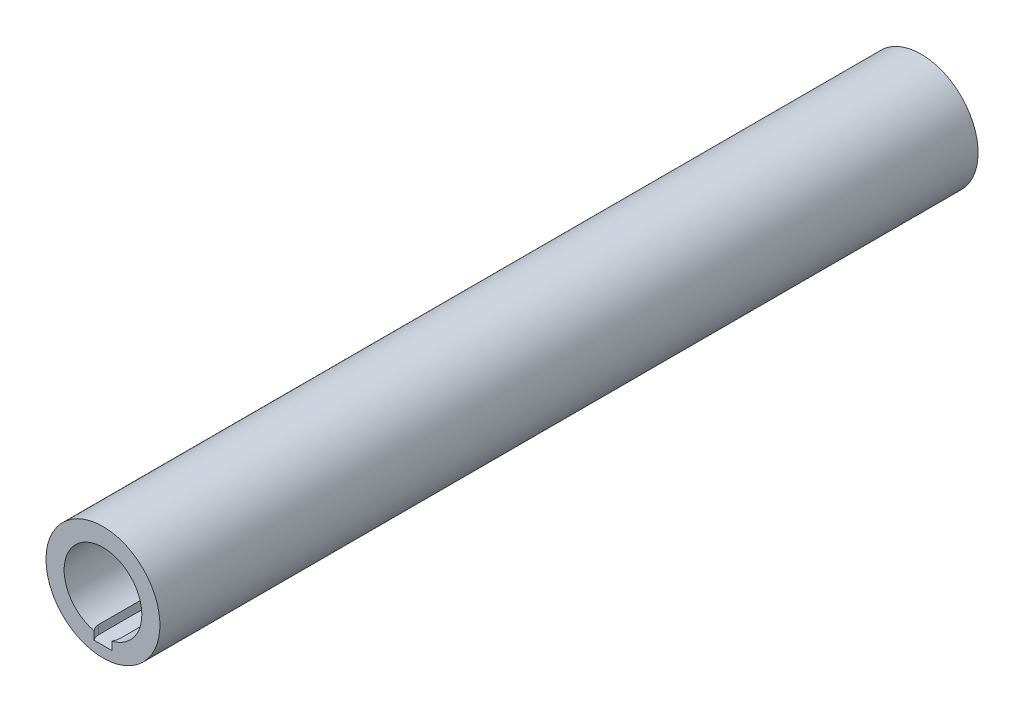
ISO-10303-21;
HEADER;
FILE_DESCRIPTION(('STEP AP214'),'2;1');
FILE_NAME('part.step','',(''),(''),'','','');
FILE_SCHEMA(('AUTOMOTIVE_DESIGN { 1 0 10303 214 1 1 1 1 }'));
ENDSEC;
DATA;
#1=APPLICATION_CONTEXT('core data for automotive mechanical design processes');
#2=APPLICATION_PROTOCOL_DEFINITION('international standard','automotive_design',2000,#1);
#3=PRODUCT_CONTEXT('',#1,'mechanical');
#4=PRODUCT('Part','Part','',(#3));
#5=PRODUCT_RELATED_PRODUCT_CATEGORY('part','',(#4));
#6=PRODUCT_DEFINITION_FORMATION('','',#4);
#7=PRODUCT_DEFINITION_CONTEXT('part definition',#1,'design');
#8=PRODUCT_DEFINITION('design','',#6,#7);
#9=PRODUCT_DEFINITION_SHAPE('','',#8);
#10=(LENGTH_UNIT() NAMED_UNIT(*) SI_UNIT(.MILLI.,.METRE.));
#11=(NAMED_UNIT(*) PLANE_ANGLE_UNIT() SI_UNIT($,.RADIAN.));
#12=(NAMED_UNIT(*) SI_UNIT($,.STERADIAN.) SOLID_ANGLE_UNIT());
#13=UNCERTAINTY_MEASURE_WITH_UNIT(LENGTH_MEASURE(1.E-05),#10,'distance_accuracy_value','');
#14=(GEOMETRIC_REPRESENTATION_CONTEXT(3) GLOBAL_UNCERTAINTY_ASSIGNED_CONTEXT((#13)) GLOBAL_UNIT_ASSIGNED_CONTEXT((#10,
#11,#12)) REPRESENTATION_CONTEXT('',''));
#15=CARTESIAN_POINT('',(0.,0.,0.));
#16=DIRECTION('',(0.,0.,1.));
#17=DIRECTION('',(1.,0.,0.));
#18=AXIS2_PLACEMENT_3D('',#15,#16,#17);
#19=CARTESIAN_POINT('',(25.4999999999999,0.,-516.518644329431));
#20=DIRECTION('',(0.,0.,-1.));
#21=DIRECTION('',(-1.,0.,0.));
#22=AXIS2_PLACEMENT_3D('',#19,#20,#21);
#23=PLANE('',#22);
#24=CARTESIAN_POINT('',(-1.80000000000006,0.,-516.518644329431));
#25=DIRECTION('',(0.,0.,-1.));
#26=DIRECTION('',(-1.,0.,0.));
#27=AXIS2_PLACEMENT_3D('',#24,#25,#26);
#28=CIRCLE('',#27,40.);
#29=CARTESIAN_POINT('',(-41.8000000000001,0.,-516.518644329431));
#30=VERTEX_POINT('',#29);
#31=EDGE_CURVE('E254',#30,#30,#28,.T.);
#32=ORIENTED_EDGE('',*,*,#31,.T.);
#33=EDGE_LOOP('',(#32));
#34=FACE_BOUND('',#33,.T.);
#35=CARTESIAN_POINT('',(-1.80000000000006,0.,-516.518644329431));
#36=DIRECTION('',(0.,0.,-1.));
#37=DIRECTION('',(-1.,0.,0.));
#38=AXIS2_PLACEMENT_3D('',#35,#36,#37);
#39=CIRCLE('',#38,27.3);
#40=CARTESIAN_POINT('',(-9.79999999999999,-26.101532522057,-516.518644329431));
#41=VERTEX_POINT('',#40);
#42=CARTESIAN_POINT('',(6.19999999999995,-26.101532522057,-516.518644329431));
#43=VERTEX_POINT('',#42);
#44=EDGE_CURVE('E257',#41,#43,#39,.T.);
#45=ORIENTED_EDGE('',*,*,#44,.F.);
#46=DIRECTION('',(0.,-1.,0.));
#47=VECTOR('',#46,1.);
#48=CARTESIAN_POINT('',(-9.80000000000017,0.,-516.518644329431));
#49=LINE('',#48,#47);
#50=CARTESIAN_POINT('',(-9.80000000000016,-32.3,-516.518644329431));
#51=VERTEX_POINT('',#50);
#52=EDGE_CURVE('E179',#41,#51,#49,.T.);
#53=ORIENTED_EDGE('',*,*,#52,.T.);
#54=DIRECTION('',(1.,0.,0.));
#55=VECTOR('',#54,1.);
#56=CARTESIAN_POINT('',(25.4999999999999,-32.3,-516.518644329431));
#57=LINE('',#56,#55);
#58=CARTESIAN_POINT('',(6.19999999999984,-32.3,-516.518644329431));
#59=VERTEX_POINT('',#58);
#60=EDGE_CURVE('E11',#51,#59,#57,.T.);
#61=ORIENTED_EDGE('',*,*,#60,.T.);
#62=DIRECTION('',(0.,1.,0.));
#63=VECTOR('',#62,1.);
#64=CARTESIAN_POINT('',(6.19999999999984,0.,-516.518644329431));
#65=LINE('',#64,#63);
#66=EDGE_CURVE('E148',#59,#43,#65,.T.);
#67=ORIENTED_EDGE('',*,*,#66,.T.);
#68=EDGE_LOOP('',(#45,#53,#61,#67));
#69=FACE_BOUND('',#68,.T.);
#70=ADVANCED_FACE('F43',(#34,#69),#23,.T.);
#71=CARTESIAN_POINT('',(38.1999999999999,0.,57.9999996705684));
#72=DIRECTION('',(0.,0.,1.));
#73=DIRECTION('',(1.,0.,0.));
#74=AXIS2_PLACEMENT_3D('',#71,#72,#73);
#75=PLANE('',#74);
#76=CARTESIAN_POINT('',(-1.80000000000013,0.,57.9999996705684));
#77=DIRECTION('',(0.,0.,-1.));
#78=DIRECTION('',(-1.,0.,0.));
#79=AXIS2_PLACEMENT_3D('',#76,#77,#78);
#80=CIRCLE('',#79,40.0000000000001);
#81=CARTESIAN_POINT('',(-41.8000000000002,0.,57.9999996705684));
#82=VERTEX_POINT('',#81);
#83=EDGE_CURVE('E292',#82,#82,#80,.T.);
#84=ORIENTED_EDGE('',*,*,#83,.F.);
#85=EDGE_LOOP('',(#84));
#86=FACE_BOUND('',#85,.T.);
#87=DIRECTION('',(-1.,0.,0.));
#88=VECTOR('',#87,1.);
#89=CARTESIAN_POINT('',(38.1999999999999,-32.3,57.9999996705684));
#90=LINE('',#89,#88);
#91=CARTESIAN_POINT('',(4.44499826260965,-32.3,57.9999996705684));
#92=VERTEX_POINT('',#91);
#93=CARTESIAN_POINT('',(-8.04499826260998,-32.3,57.9999996705684));
#94=VERTEX_POINT('',#93);
#95=EDGE_CURVE('E50',#92,#94,#90,.T.);
#96=ORIENTED_EDGE('',*,*,#95,.T.);
#97=DIRECTION('',(0.,-1.,0.));
#98=VECTOR('',#97,1.);
#99=CARTESIAN_POINT('',(-8.04499826260998,-17.3,57.9999996705684));
#100=LINE('',#99,#98);
#101=CARTESIAN_POINT('',(-8.04499826260997,-26.5761170357899,57.9999996705684));
#102=VERTEX_POINT('',#101);
#103=EDGE_CURVE('E267',#94,#102,#100,.F.);
#104=ORIENTED_EDGE('',*,*,#103,.T.);
#105=CARTESIAN_POINT('',(-1.80000000000013,0.,57.9999996705684));
#106=DIRECTION('',(0.,0.,-1.));
#107=DIRECTION('',(-1.,0.,0.));
#108=AXIS2_PLACEMENT_3D('',#105,#106,#107);
#109=CIRCLE('',#108,27.3);
#110=CARTESIAN_POINT('',(4.44499826260965,-26.5761170357899,57.9999996705684));
#111=VERTEX_POINT('',#110);
#112=EDGE_CURVE('E289',#102,#111,#109,.T.);
#113=ORIENTED_EDGE('',*,*,#112,.T.);
#114=DIRECTION('',(0.,-1.,0.));
#115=VECTOR('',#114,1.);
#116=CARTESIAN_POINT('',(4.44499826260965,-17.3,57.9999996705684));
#117=LINE('',#116,#115);
#118=EDGE_CURVE('E261',#111,#92,#117,.T.);
#119=ORIENTED_EDGE('',*,*,#118,.T.);
#120=EDGE_LOOP('',(#96,#104,#113,#119));
#121=FACE_BOUND('',#120,.T.);
#122=ADVANCED_FACE('F241',(#86,#121),#75,.T.);
#123=CARTESIAN_POINT('',(-1.80000000000013,0.,70.));
#124=DIRECTION('',(0.,0.,-1.));
#125=DIRECTION('',(-1.,0.,0.));
#126=AXIS2_PLACEMENT_3D('',#123,#124,#125);
#127=CYLINDRICAL_SURFACE('',#126,27.3);
#128=DIRECTION('',(0.,0.,-1.));
#129=VECTOR('',#128,1.);
#130=CARTESIAN_POINT('',(6.19999999999984,-26.101532522057,70.));
#131=LINE('',#130,#129);
#132=CARTESIAN_POINT('',(6.19999999999984,-26.101532522057,-6.99999999943164));
#133=VERTEX_POINT('',#132);
#134=CARTESIAN_POINT('',(6.19999999999984,-26.101532522057,53.0000000005684));
#135=VERTEX_POINT('',#134);
#136=EDGE_CURVE('E326',#133,#135,#131,.F.);
#137=ORIENTED_EDGE('',*,*,#136,.T.);
#138=CARTESIAN_POINT('',(6.19999999999984,-26.101532522057,53.0000000005684));
#139=CARTESIAN_POINT('',(6.20002948878216,-26.1015018706924,53.2198102646668));
#140=CARTESIAN_POINT('',(6.19094198500112,-26.1043081395153,53.4396094489077));
#141=CARTESIAN_POINT('',(6.15475114484065,-26.1153708185064,53.8775354441549));
#142=CARTESIAN_POINT('',(6.12765170316702,-26.1236260504471,54.0956626063894));
#143=CARTESIAN_POINT('',(6.05574303388673,-26.1453365468854,54.5281610713225));
#144=CARTESIAN_POINT('',(6.01097729419861,-26.1587790404665,54.7425402569696));
#145=CARTESIAN_POINT('',(5.90413701983784,-26.1904447155412,55.1665808502656));
#146=CARTESIAN_POINT('',(5.84206206546851,-26.2086680129542,55.3762421433864));
#147=CARTESIAN_POINT('',(5.70115976860022,-26.2493421713694,55.7893006650064));
#148=CARTESIAN_POINT('',(5.62234160065353,-26.271790716355,55.9927012544976));
#149=CARTESIAN_POINT('',(5.44852167873535,-26.3202787489287,56.3921065467969));
#150=CARTESIAN_POINT('',(5.35351392563954,-26.3463195669661,56.5881084749908));
#151=CARTESIAN_POINT('',(5.14801562628257,-26.4012572901199,56.971446030117));
#152=CARTESIAN_POINT('',(5.03752210656999,-26.4301547434296,57.1587799834844));
#153=CARTESIAN_POINT('',(4.80182466914796,-26.4900111505534,57.5236135955987));
#154=CARTESIAN_POINT('',(4.67661997841758,-26.520970212661,57.7011127368385));
#155=CARTESIAN_POINT('',(4.40872652290667,-26.5849804654594,58.0498881759642));
#156=CARTESIAN_POINT('',(4.26565527525876,-26.6180656399517,58.220864564118));
#157=CARTESIAN_POINT('',(3.96579119910749,-26.6846254208654,58.5502483936385));
#158=CARTESIAN_POINT('',(3.80899814794841,-26.7181000335981,58.7086556309733));
#159=CARTESIAN_POINT('',(3.48265585819677,-26.7845342292942,59.0119191434094));
#160=CARTESIAN_POINT('',(3.31310432121148,-26.8174937181621,59.1567729663196));
#161=CARTESIAN_POINT('',(2.96233890664028,-26.8819999578179,59.4319370979455));
#162=CARTESIAN_POINT('',(2.7811253626955,-26.9135467489782,59.5622478224369));
#163=CARTESIAN_POINT('',(2.40445590112168,-26.9749824168085,59.8098717366289));
#164=CARTESIAN_POINT('',(2.20878824114938,-27.0048257743522,59.9268744601951));
#165=CARTESIAN_POINT('',(1.80789075268649,-27.0613022645236,60.1438824897572));
#166=CARTESIAN_POINT('',(1.60266444040875,-27.0879365648924,60.2438939841418));
#167=CARTESIAN_POINT('',(1.18400971574309,-27.137245715161,60.4261569107361));
#168=CARTESIAN_POINT('',(0.97058139492467,-27.1599206092492,60.508408541154));
#169=CARTESIAN_POINT('',(0.537067609615338,-27.2006526184794,60.654438212711));
#170=CARTESIAN_POINT('',(0.316982362087911,-27.2187098839388,60.7182168552091));
#171=CARTESIAN_POINT('',(-0.122099732297788,-27.2492522862494,60.8252353045268));
#172=CARTESIAN_POINT('',(-0.340961672682359,-27.2618763326304,60.8689892115048));
#173=CARTESIAN_POINT('',(-0.781808041596744,-27.2818981069175,60.9380766182966));
#174=CARTESIAN_POINT('',(-1.00379237494661,-27.2892959937822,60.9634106783679));
#175=CARTESIAN_POINT('',(-1.44918415280929,-27.2986544821174,60.9954218977174));
#176=CARTESIAN_POINT('',(-1.67259138512288,-27.3006158761531,61.0021017765175));
#177=CARTESIAN_POINT('',(-2.11916019734714,-27.2990474133831,60.9967491624429));
#178=CARTESIAN_POINT('',(-2.34232178147402,-27.2955176523438,60.9847169959086));
#179=CARTESIAN_POINT('',(-2.77989373900663,-27.2832594103852,60.9427092373773));
#180=CARTESIAN_POINT('',(-2.99436280041777,-27.2746934691406,60.9132945109399));
#181=CARTESIAN_POINT('',(-3.42004456610357,-27.2527226733909,60.8372328204209));
#182=CARTESIAN_POINT('',(-3.63125615453542,-27.2393161975399,60.7905800823131));
#183=CARTESIAN_POINT('',(-4.04882819985621,-27.2080245243072,60.6804545211442));
#184=CARTESIAN_POINT('',(-4.25519024715194,-27.1901408183031,60.6169872986247));
#185=CARTESIAN_POINT('',(-4.66184397375862,-27.1503518837691,60.4737100721368));
#186=CARTESIAN_POINT('',(-4.862133339475,-27.1284451444121,60.3938939271211));
#187=CARTESIAN_POINT('',(-5.25743291131256,-27.080919919851,60.217583119805));
#188=CARTESIAN_POINT('',(-5.45236140934567,-27.055263455803,60.120915573902));
#189=CARTESIAN_POINT('',(-5.83346246461587,-27.0010785531453,59.9121921153252));
#190=CARTESIAN_POINT('',(-6.01963198565936,-26.9725491292649,59.8001309186262));
#191=CARTESIAN_POINT('',(-6.3820109922499,-26.9133588703243,59.5614214208367));
#192=CARTESIAN_POINT('',(-6.55822044657898,-26.8826980285843,59.4347730740293));
#193=CARTESIAN_POINT('',(-6.89963114235819,-26.8200278058968,59.1677172385765));
#194=CARTESIAN_POINT('',(-7.06483207813754,-26.788018387544,59.0273093681412));
#195=CARTESIAN_POINT('',(-7.38913345610687,-26.7222747200428,58.7281785470519));
#196=CARTESIAN_POINT('',(-7.54778267979136,-26.6885204498991,58.56897044243));
#197=CARTESIAN_POINT('',(-7.85111384618484,-26.6213852034581,58.237788590607));
#198=CARTESIAN_POINT('',(-7.99580028404877,-26.5880041101015,58.0658189835737));
#199=CARTESIAN_POINT('',(-8.27039568796669,-26.5225172553888,57.7100431084482));
#200=CARTESIAN_POINT('',(-8.4002948149211,-26.4904123523151,57.5262290852757));
#201=CARTESIAN_POINT('',(-8.64424891342918,-26.4284334772892,57.1481149224532));
#202=CARTESIAN_POINT('',(-8.75831003737664,-26.3985586411478,56.9538188955737));
#203=CARTESIAN_POINT('',(-8.97083379156821,-26.3416280854156,56.5539969954341));
#204=CARTESIAN_POINT('',(-9.06913343237846,-26.3146027038658,56.3483800758959));
#205=CARTESIAN_POINT('',(-9.24794180443295,-26.2645537792759,55.9291749018791));
#206=CARTESIAN_POINT('',(-9.32845778578533,-26.2415286062362,55.7155899375086));
#207=CARTESIAN_POINT('',(-9.47097573666229,-26.2002221328629,55.2821316101759));
#208=CARTESIAN_POINT('',(-9.53299712280937,-26.1819358600373,55.0622651096323));
#209=CARTESIAN_POINT('',(-9.63804633691206,-26.1506792627958,54.6177628247898));
#210=CARTESIAN_POINT('',(-9.68108294450186,-26.1377064813201,54.3931292955162));
#211=CARTESIAN_POINT('',(-9.74290656382249,-26.1189808287715,53.9738254721012));
#212=CARTESIAN_POINT('',(-9.76431783666095,-26.1124500294885,53.7795724620505));
#213=CARTESIAN_POINT('',(-9.79286205721764,-26.1037199792531,53.390217996849));
#214=CARTESIAN_POINT('',(-9.80001640153572,-26.1015142373947,53.1951182541835));
#215=CARTESIAN_POINT('',(-9.80000000000016,-26.101532522057,53.0000000005684));
#216=B_SPLINE_CURVE_WITH_KNOTS('',3,(#138,#139,#140,#141,#142,#143,#144,#145,#146,#147,#148,
#149,#150,#151,#152,#153,#154,#155,#156,#157,#158,#159,#160,#161,#162,#163,#164,#165,#166,#167,
#168,#169,#170,#171,#172,#173,#174,#175,#176,#177,#178,#179,#180,#181,#182,#183,#184,#185,#186,
#187,#188,#189,#190,#191,#192,#193,#194,#195,#196,#197,#198,#199,#200,#201,#202,#203,#204,#205,
#206,#207,#208,#209,#210,#211,#212,#213,#214,#215),.UNSPECIFIED.,.F.,.F.,(4,2,2,2,2,2,2,2,2,2,2,
2,2,2,2,2,2,2,2,2,2,2,2,2,2,2,2,2,2,2,2,2,2,2,2,2,2,2,4),(0.,0.659208064264059,1.31827363488865,
1.97572684860683,2.63319600498575,3.29030582192163,3.94765966550193,4.60513990220851,
5.26265470268176,5.93802604244323,6.61340834309465,7.2889126039254,7.96439754767811,
8.6533324733988,9.34201594117221,10.0306917225249,10.7193450825949,11.3891609111078,
12.0589563656764,12.728654168228,13.3983402912987,14.0475150076187,14.6969073682305,
15.3460837016184,15.9955043298494,16.6520284588488,17.3087785121203,17.9655306237386,
18.6223009636354,19.3033481502027,19.9841753450257,20.6654529293139,21.346465121264,
22.034119519925,22.7214930535006,23.4081423838758,24.0944738350553,24.6805310513513,
25.2657080567343),.UNSPECIFIED.);
#217=EDGE_CURVE('E327',#135,#111,#216,.T.);
#218=ORIENTED_EDGE('',*,*,#217,.T.);
#219=ORIENTED_EDGE('',*,*,#112,.F.);
#220=CARTESIAN_POINT('',(-9.80000000000016,-26.101532522057,53.0000000005684));
#221=VERTEX_POINT('',#220);
#222=EDGE_CURVE('E319',#102,#221,#216,.T.);
#223=ORIENTED_EDGE('',*,*,#222,.T.);
#224=DIRECTION('',(0.,0.,-1.));
#225=VECTOR('',#224,1.);
#226=CARTESIAN_POINT('',(-9.80000000000016,-26.101532522057,70.));
#227=LINE('',#226,#225);
#228=CARTESIAN_POINT('',(-9.80000000000016,-26.101532522057,-6.99999999943164));
#229=VERTEX_POINT('',#228);
#230=EDGE_CURVE('E224',#221,#229,#227,.T.);
#231=ORIENTED_EDGE('',*,*,#230,.T.);
#232=CARTESIAN_POINT('',(-9.80000000000016,-26.101532522057,-6.99999999943164));
#233=CARTESIAN_POINT('',(-9.80003135739679,-26.1015001348068,-7.22266194627266));
#234=CARTESIAN_POINT('',(-9.79070551489242,-26.1043805710184,-7.44531437896619));
#235=CARTESIAN_POINT('',(-9.7535709656601,-26.1157309525173,-7.88886986114167));
#236=CARTESIAN_POINT('',(-9.72576729861018,-26.1241993737221,-8.10977337100899));
#237=CARTESIAN_POINT('',(-9.65294031344721,-26.1461783980818,-8.54209813438799));
#238=CARTESIAN_POINT('',(-9.60841986799204,-26.1595414969144,-8.75361186747744));
#239=CARTESIAN_POINT('',(-9.50252428240405,-26.1909180195519,-9.17202331096222));
#240=CARTESIAN_POINT('',(-9.44114874043203,-26.2089315542264,-9.37892091117804));
#241=CARTESIAN_POINT('',(-9.29790160355372,-26.2502828173449,-9.79885064063388));
#242=CARTESIAN_POINT('',(-9.21502885439799,-26.2738733034317,-10.0115168111517));
#243=CARTESIAN_POINT('',(-9.031624350498,-26.3249436975196,-10.4286345757137));
#244=CARTESIAN_POINT('',(-8.93108987421355,-26.3524242048169,-10.6330848977824));
#245=CARTESIAN_POINT('',(-8.70983718597567,-26.4113169414055,-11.0384478136334));
#246=CARTESIAN_POINT('',(-8.58859585726622,-26.4428236905491,-11.2390611358113));
#247=CARTESIAN_POINT('',(-8.32922137498181,-26.5080567957181,-11.6286186123414));
#248=CARTESIAN_POINT('',(-8.1910913396281,-26.541782741476,-11.8175649111504));
#249=CARTESIAN_POINT('',(-8.04499773418712,-26.5761171599615,-12.0000003294316));
#250=B_SPLINE_CURVE_WITH_KNOTS('',3,(#232,#233,#234,#235,#236,#237,#238,#239,#240,#241,#242,
#243,#244,#245,#246,#247,#248,#249),.UNSPECIFIED.,.F.,.F.,(4,2,2,2,2,2,2,2,4),(0.,
0.667758426312961,1.33533480158861,1.98425728464124,2.63319523987656,3.32069208785383,
4.00829496702979,4.71692040997567,5.42541521393216),.UNSPECIFIED.);
#251=CARTESIAN_POINT('',(-8.04499773418712,-26.5761171599615,-12.0000003294316));
#252=VERTEX_POINT('',#251);
#253=EDGE_CURVE('E185',#229,#252,#250,.T.);
#254=ORIENTED_EDGE('',*,*,#253,.T.);
#255=CARTESIAN_POINT('',(-1.80000000000012,0.,-12.0000003294316));
#256=DIRECTION('',(0.,0.,-1.));
#257=DIRECTION('',(-1.,0.,0.));
#258=AXIS2_PLACEMENT_3D('',#255,#256,#257);
#259=CIRCLE('',#258,27.3);
#260=CARTESIAN_POINT('',(4.4449977341868,-26.5761171599615,-12.0000003294316));
#261=VERTEX_POINT('',#260);
#262=EDGE_CURVE('E286',#252,#261,#259,.T.);
#263=ORIENTED_EDGE('',*,*,#262,.T.);
#264=CARTESIAN_POINT('',(4.4449977341868,-26.5761171599615,-12.0000003294316));
#265=CARTESIAN_POINT('',(4.58509857809723,-26.5431918357468,-11.8250438969062));
#266=CARTESIAN_POINT('',(4.71787724607053,-26.5108248079305,-11.6441035324423));
#267=CARTESIAN_POINT('',(4.96793318251863,-26.4480955106246,-11.2714582120953));
#268=CARTESIAN_POINT('',(5.08520892298793,-26.4177334388958,-11.0797521977735));
#269=CARTESIAN_POINT('',(5.30026739344772,-26.3607324627651,-10.6924091520828));
#270=CARTESIAN_POINT('',(5.39851015527836,-26.3340121504097,-10.4970395644173));
#271=CARTESIAN_POINT('',(5.57880818439045,-26.2840625960632,-10.0985491136226));
#272=CARTESIAN_POINT('',(5.66086450984281,-26.2608331258858,-9.89542875822832));
#273=CARTESIAN_POINT('',(5.8099620880159,-26.2180215675412,-9.47767223951387));
#274=CARTESIAN_POINT('',(5.87658472954899,-26.1985431577219,-9.26287574103653));
#275=CARTESIAN_POINT('',(5.99158491405511,-26.1645710345289,-8.82805665493598));
#276=CARTESIAN_POINT('',(6.0399617998588,-26.1500775007004,-8.60803387937786));
#277=CARTESIAN_POINT('',(6.11917655291384,-26.1262036051689,-8.15775732104453));
#278=CARTESIAN_POINT('',(6.14944625084064,-26.1169892319647,-7.92739440592206));
#279=CARTESIAN_POINT('',(6.18987921270183,-26.1046337184351,-7.46469174488499));
#280=CARTESIAN_POINT('',(6.20003729227189,-26.1014941440735,-7.23235150475381));
#281=CARTESIAN_POINT('',(6.19999999999984,-26.101532522057,-6.99999999943164));
#282=B_SPLINE_CURVE_WITH_KNOTS('',3,(#264,#265,#266,#267,#268,#269,#270,#271,#272,#273,#274,
#275,#276,#277,#278,#279,#280,#281),.UNSPECIFIED.,.F.,.F.,(4,2,2,2,2,2,2,2,4),(0.,
0.67945546624618,1.35897785139032,2.01914773204428,2.67927444048775,3.3556258229534,
4.03200156368372,4.72861759759147,5.42541318151252),.UNSPECIFIED.);
#283=EDGE_CURVE('E194',#261,#133,#282,.T.);
#284=ORIENTED_EDGE('',*,*,#283,.T.);
#285=EDGE_LOOP('',(#137,#218,#219,#223,#231,#254,#263,#284));
#286=FACE_BOUND('',#285,.T.);
#287=ADVANCED_FACE('F200',(#286),#127,.F.);
#288=CARTESIAN_POINT('',(25.4999999999999,0.,-12.0000003294316));
#289=DIRECTION('',(0.,0.,-1.));
#290=DIRECTION('',(-1.,0.,0.));
#291=AXIS2_PLACEMENT_3D('',#288,#289,#290);
#292=PLANE('',#291);
#293=CARTESIAN_POINT('',(-1.80000000000012,0.,-12.0000003294316));
#294=DIRECTION('',(0.,0.,-1.));
#295=DIRECTION('',(-1.,0.,0.));
#296=AXIS2_PLACEMENT_3D('',#293,#294,#295);
#297=CIRCLE('',#296,30.8);
#298=CARTESIAN_POINT('',(-8.04499773418712,-30.1602387805534,-12.0000003294316));
#299=VERTEX_POINT('',#298);
#300=CARTESIAN_POINT('',(4.4449977341868,-30.1602387805534,-12.0000003294316));
#301=VERTEX_POINT('',#300);
#302=EDGE_CURVE('E284',#299,#301,#297,.T.);
#303=ORIENTED_EDGE('',*,*,#302,.T.);
#304=DIRECTION('',(0.,-1.,0.));
#305=VECTOR('',#304,1.);
#306=CARTESIAN_POINT('',(4.4449977341868,-17.3,-12.0000003294316));
#307=LINE('',#306,#305);
#308=EDGE_CURVE('E57',#301,#261,#307,.F.);
#309=ORIENTED_EDGE('',*,*,#308,.T.);
#310=ORIENTED_EDGE('',*,*,#262,.F.);
#311=DIRECTION('',(0.,-1.,0.));
#312=VECTOR('',#311,1.);
#313=CARTESIAN_POINT('',(-8.04499773418712,-17.3,-12.0000003294316));
#314=LINE('',#313,#312);
#315=EDGE_CURVE('E181',#252,#299,#314,.T.);
#316=ORIENTED_EDGE('',*,*,#315,.T.);
#317=EDGE_LOOP('',(#303,#309,#310,#316));
#318=FACE_BOUND('',#317,.T.);
#319=ADVANCED_FACE('F232',(#318),#292,.T.);
#320=CARTESIAN_POINT('',(-1.80000000000013,0.,70.));
#321=DIRECTION('',(0.,0.,-1.));
#322=DIRECTION('',(-1.,0.,0.));
#323=AXIS2_PLACEMENT_3D('',#320,#321,#322);
#324=CYLINDRICAL_SURFACE('',#323,30.8);
#325=CARTESIAN_POINT('',(-1.80000000000012,0.,-22.0000003294316));
#326=DIRECTION('',(0.,0.,-1.));
#327=DIRECTION('',(-1.,0.,0.));
#328=AXIS2_PLACEMENT_3D('',#325,#326,#327);
#329=CIRCLE('',#328,30.8);
#330=CARTESIAN_POINT('',(-32.6000000000001,0.,-22.0000003294316));
#331=VERTEX_POINT('',#330);
#332=EDGE_CURVE('E281',#331,#331,#329,.T.);
#333=ORIENTED_EDGE('',*,*,#332,.T.);
#334=EDGE_LOOP('',(#333));
#335=FACE_BOUND('',#334,.T.);
#336=ORIENTED_EDGE('',*,*,#302,.F.);
#337=CARTESIAN_POINT('',(-9.80000000000016,-29.7428983120341,-6.99999999943164));
#338=CARTESIAN_POINT('',(-9.80002835948215,-29.7428716648464,-7.22093453482374));
#339=CARTESIAN_POINT('',(-9.79084900702757,-29.7453591127096,-7.44185970241672));
#340=CARTESIAN_POINT('',(-9.75428372680723,-29.7551681302083,-7.88205197995079));
#341=CARTESIAN_POINT('',(-9.72690104537877,-29.7624888378904,-8.10131937848395));
#342=CARTESIAN_POINT('',(-9.65421333891393,-29.7817504229373,-8.53618490607602));
#343=CARTESIAN_POINT('',(-9.60894563469834,-29.7936816783048,-8.75178970693653));
#344=CARTESIAN_POINT('',(-9.50087665456625,-29.8217979606718,-9.17827550198134));
#345=CARTESIAN_POINT('',(-9.43807509913023,-29.8379830554845,-9.389156420801));
#346=CARTESIAN_POINT('',(-9.29547074775784,-29.8741245116514,-9.80466587995765));
#347=CARTESIAN_POINT('',(-9.21567411969265,-29.894079504534,-10.0092966578789));
#348=CARTESIAN_POINT('',(-9.0396492145382,-29.9371957448948,-10.4111003673715));
#349=CARTESIAN_POINT('',(-8.94341485923405,-29.9603581777933,-10.6082705071435));
#350=CARTESIAN_POINT('',(-8.73523150181924,-30.0092317544343,-10.9938158264572));
#351=CARTESIAN_POINT('',(-8.62328139362208,-30.0349430775321,-11.1821903857148));
#352=CARTESIAN_POINT('',(-8.38444514725062,-30.0882044532695,-11.5489532384398));
#353=CARTESIAN_POINT('',(-8.25755832048234,-30.1157545906544,-11.7273410709518));
#354=CARTESIAN_POINT('',(-7.98684217802837,-30.1725456361308,-12.0766967496238));
#355=CARTESIAN_POINT('',(-7.8427099270007,-30.2018100417019,-12.2474261017249));
#356=CARTESIAN_POINT('',(-7.54070761196762,-30.2606665127957,-12.5762087349543));
#357=CARTESIAN_POINT('',(-7.38283736680376,-30.2902585826345,-12.7342618488723));
#358=CARTESIAN_POINT('',(-7.05435793345689,-30.3489630321788,-13.0366853517874));
#359=CARTESIAN_POINT('',(-6.88374653106285,-30.3780753274289,-13.1810533525899));
#360=CARTESIAN_POINT('',(-6.53091521022928,-30.4350187799055,-13.4551017143334));
#361=CARTESIAN_POINT('',(-6.34869561004713,-30.4628499722193,-13.5847824776781));
#362=CARTESIAN_POINT('',(-5.97093780728692,-30.5168843768686,-13.8304329429897));
#363=CARTESIAN_POINT('',(-5.77523785643764,-30.5430559639546,-13.9461610678904));
#364=CARTESIAN_POINT('',(-5.37448642768443,-30.5925446566722,-14.1606338625343));
#365=CARTESIAN_POINT('',(-5.16943835031914,-30.615862789102,-14.2593846466806));
#366=CARTESIAN_POINT('',(-4.75135386110467,-30.6589900128161,-14.4391726222372));
#367=CARTESIAN_POINT('',(-4.53831732569331,-30.678799049796,-14.5202095395241));
#368=CARTESIAN_POINT('',(-4.10579852162377,-30.7143348930111,-14.6638905419594));
#369=CARTESIAN_POINT('',(-3.88631641579262,-30.7300618022699,-14.7265350912941));
#370=CARTESIAN_POINT('',(-3.44737084243983,-30.7566815075019,-14.8317297232683));
#371=CARTESIAN_POINT('',(-3.22801099185717,-30.767672089885,-14.8746875784228));
#372=CARTESIAN_POINT('',(-2.78628750911556,-30.7849977364418,-14.9421124365102));
#373=CARTESIAN_POINT('',(-2.56392394811589,-30.7913329107078,-14.9665798767102));
#374=CARTESIAN_POINT('',(-2.11786865305554,-30.7991673695446,-14.9968071302001));
#375=CARTESIAN_POINT('',(-1.89417706936939,-30.8006671915497,-15.0025690225534));
#376=CARTESIAN_POINT('',(-1.44711932841595,-30.798789562924,-14.99533935354));
#377=CARTESIAN_POINT('',(-1.22375316680806,-30.7954121779546,-14.9823480446456));
#378=CARTESIAN_POINT('',(-0.784393511081207,-30.7840164608562,-14.9382685245305));
#379=CARTESIAN_POINT('',(-0.568352258812197,-30.7761122049208,-14.9076250377147));
#380=CARTESIAN_POINT('',(-0.139616741514722,-30.7559620060381,-14.8288344327726));
#381=CARTESIAN_POINT('',(0.0730763690997929,-30.7437145984268,-14.7806814096736));
#382=CARTESIAN_POINT('',(0.493501400123503,-30.7152117647439,-14.6672838175978));
#383=CARTESIAN_POINT('',(0.701234950234842,-30.6989576757098,-14.6020449497485));
#384=CARTESIAN_POINT('',(1.11049686632651,-30.662863995065,-14.4549520522818));
#385=CARTESIAN_POINT('',(1.31202287643541,-30.6430230613366,-14.3730918018956));
#386=CARTESIAN_POINT('',(1.70929707934691,-30.6000836974509,-14.1925570342432));
#387=CARTESIAN_POINT('',(1.9049749979926,-30.5769569590432,-14.0937346558275));
#388=CARTESIAN_POINT('',(2.28739454476304,-30.5281899348094,-13.8804907926293));
#389=CARTESIAN_POINT('',(2.47413306679235,-30.5025487846215,-13.7660639382862));
#390=CARTESIAN_POINT('',(2.83742071064086,-30.4494340324613,-13.5224351960042));
#391=CARTESIAN_POINT('',(3.01397021634907,-30.4219604996114,-13.3932338652672));
#392=CARTESIAN_POINT('',(3.35579598182603,-30.3658981726359,-13.1209086113622));
#393=CARTESIAN_POINT('',(3.52107199919254,-30.3373093545503,-12.977784388985));
#394=CARTESIAN_POINT('',(3.8439886106498,-30.2789217098906,-12.6741462036367));
#395=CARTESIAN_POINT('',(4.0012641716677,-30.2491119579254,-12.5132458898679));
#396=CARTESIAN_POINT('',(4.30169621159347,-30.1899444056161,-12.1787854463604));
#397=CARTESIAN_POINT('',(4.44485732490583,-30.1605864596137,-12.0052295048101));
#398=CARTESIAN_POINT('',(4.71623754251108,-30.10312117479,-11.6464261968204));
#399=CARTESIAN_POINT('',(4.8444468939379,-30.0750146595696,-11.4611713193845));
#400=CARTESIAN_POINT('',(5.0848621918683,-30.0208903228986,-11.0803622460489));
#401=CARTESIAN_POINT('',(5.19707431081309,-29.9948716975506,-10.8848120626314));
#402=CARTESIAN_POINT('',(5.40540287370026,-29.9455123720441,-10.4833385849549));
#403=CARTESIAN_POINT('',(5.50140896530863,-29.922190347719,-10.2773556868457));
#404=CARTESIAN_POINT('',(5.67562602448856,-29.879141049789,-9.85772678258089));
#405=CARTESIAN_POINT('',(5.75384412564033,-29.8594123357806,-9.64408388827433));
#406=CARTESIAN_POINT('',(5.89180758700414,-29.824170866347,-9.21082124984733));
#407=CARTESIAN_POINT('',(5.9515720944699,-29.8086537430568,-8.99120795981251));
#408=CARTESIAN_POINT('',(6.05219321329671,-29.7823062109028,-8.54750765877639));
#409=CARTESIAN_POINT('',(6.09305865603097,-29.7714736131537,-8.32342278847694));
#410=CARTESIAN_POINT('',(6.14950421725201,-29.75644613352,-7.91602761199674));
#411=CARTESIAN_POINT('',(6.16844487799024,-29.7513729859879,-7.73320762810097));
#412=CARTESIAN_POINT('',(6.19368834074981,-29.7445958148257,-7.36693011057122));
#413=CARTESIAN_POINT('',(6.20001133863907,-29.7428864072447,-7.18347406734837));
#414=CARTESIAN_POINT('',(6.19999999999984,-29.7428983120341,-6.99999999943164));
#415=B_SPLINE_CURVE_WITH_KNOTS('',3,(#337,#338,#339,#340,#341,#342,#343,#344,#345,#346,#347,
#348,#349,#350,#351,#352,#353,#354,#355,#356,#357,#358,#359,#360,#361,#362,#363,#364,#365,#366,
#367,#368,#369,#370,#371,#372,#373,#374,#375,#376,#377,#378,#379,#380,#381,#382,#383,#384,#385,
#386,#387,#388,#389,#390,#391,#392,#393,#394,#395,#396,#397,#398,#399,#400,#401,#402,#403,#404,
#405,#406,#407,#408,#409,#410,#411,#412,#413,#414),.UNSPECIFIED.,.F.,.F.,(4,2,2,2,2,2,2,2,2,2,2,
2,2,2,2,2,2,2,2,2,2,2,2,2,2,2,2,2,2,2,2,2,2,2,2,2,2,2,4),(0.,0.662584683450859,1.32505123485347,
1.9861426517991,2.64724460827255,3.30810704446933,3.9692143803562,4.63036826882321,
5.29155264892801,5.96679892260832,6.64205410188976,7.31742690411925,7.99278119788135,
8.67852342065711,9.36401815308042,10.0495234928301,10.7350115303178,11.40557628451,
12.0761251804816,12.7465995444842,13.4170648820462,14.071334636394,14.725825243743,
15.3800977412468,16.0346155616064,16.6951591595357,17.3559306293253,18.0166771871196,
18.6774379477925,19.357537146408,20.0374122891006,20.7177284551553,21.3977814104908,
22.082293028538,22.7665296484931,23.4500539073526,24.133258437563,24.6844123610477,
25.2346833960853),.UNSPECIFIED.);
#416=EDGE_CURVE('E216',#299,#301,#415,.T.);
#417=ORIENTED_EDGE('',*,*,#416,.T.);
#418=EDGE_LOOP('',(#336,#417));
#419=FACE_BOUND('',#418,.T.);
#420=ADVANCED_FACE('F227',(#335,#419),#324,.F.);
#421=CARTESIAN_POINT('',(-1.80000000000013,0.,70.));
#422=DIRECTION('',(0.,0.,-1.));
#423=DIRECTION('',(-1.,0.,0.));
#424=AXIS2_PLACEMENT_3D('',#421,#422,#423);
#425=CYLINDRICAL_SURFACE('',#424,27.3);
#426=CARTESIAN_POINT('',(-1.80000000000007,0.,-446.518644329431));
#427=DIRECTION('',(0.,0.,-1.));
#428=DIRECTION('',(-1.,0.,0.));
#429=AXIS2_PLACEMENT_3D('',#426,#427,#428);
#430=CIRCLE('',#429,27.3);
#431=CARTESIAN_POINT('',(-29.1000000000001,0.,-446.518644329431));
#432=VERTEX_POINT('',#431);
#433=EDGE_CURVE('E260',#432,#432,#430,.T.);
#434=ORIENTED_EDGE('',*,*,#433,.F.);
#435=EDGE_LOOP('',(#434));
#436=FACE_BOUND('',#435,.T.);
#437=CARTESIAN_POINT('',(6.19999999999984,-26.101532522057,-461.518644329431));
#438=CARTESIAN_POINT('',(6.20002948878216,-26.1015018706924,-461.298834065333));
#439=CARTESIAN_POINT('',(6.19094198500111,-26.1043081395154,-461.079034881092));
#440=CARTESIAN_POINT('',(6.15475114484065,-26.1153708185064,-460.641108885844));
#441=CARTESIAN_POINT('',(6.12765170316702,-26.1236260504471,-460.42298172361));
#442=CARTESIAN_POINT('',(6.05574303388673,-26.1453365468854,-459.990483258677));
#443=CARTESIAN_POINT('',(6.0109772941986,-26.1587790404665,-459.77610407303));
#444=CARTESIAN_POINT('',(5.90413701983784,-26.1904447155412,-459.352063479734));
#445=CARTESIAN_POINT('',(5.84206206546851,-26.2086680129543,-459.142402186613));
#446=CARTESIAN_POINT('',(5.70115976860021,-26.2493421713694,-458.729343664993));
#447=CARTESIAN_POINT('',(5.62234160065352,-26.271790716355,-458.525943075502));
#448=CARTESIAN_POINT('',(5.44852167873535,-26.3202787489287,-458.126537783203));
#449=CARTESIAN_POINT('',(5.35351392563954,-26.3463195669661,-457.930535855009));
#450=CARTESIAN_POINT('',(5.14801562628256,-26.4012572901199,-457.547198299882));
#451=CARTESIAN_POINT('',(5.03752210656996,-26.4301547434296,-457.359864346515));
#452=CARTESIAN_POINT('',(4.80182466914795,-26.4900111505535,-456.995030734401));
#453=CARTESIAN_POINT('',(4.67661997841757,-26.520970212661,-456.817531593161));
#454=CARTESIAN_POINT('',(4.40872652290667,-26.5849804654594,-456.468756154035));
#455=CARTESIAN_POINT('',(4.26565527525876,-26.6180656399518,-456.297779765881));
#456=CARTESIAN_POINT('',(3.96579119910748,-26.6846254208654,-455.968395936361));
#457=CARTESIAN_POINT('',(3.8089981479484,-26.7181000335981,-455.809988699026));
#458=CARTESIAN_POINT('',(3.48265585819677,-26.7845342292942,-455.50672518659));
#459=CARTESIAN_POINT('',(3.31310432121149,-26.8174937181621,-455.36187136368));
#460=CARTESIAN_POINT('',(2.96233890664029,-26.8819999578179,-455.086707232054));
#461=CARTESIAN_POINT('',(2.7811253626955,-26.9135467489782,-454.956396507563));
#462=CARTESIAN_POINT('',(2.40445590112168,-26.9749824168085,-454.708772593371));
#463=CARTESIAN_POINT('',(2.20878824114939,-27.0048257743522,-454.591769869804));
#464=CARTESIAN_POINT('',(1.80789075268651,-27.0613022645236,-454.374761840242));
#465=CARTESIAN_POINT('',(1.60266444040876,-27.0879365648924,-454.274750345858));
#466=CARTESIAN_POINT('',(1.18400971574309,-27.137245715161,-454.092487419263));
#467=CARTESIAN_POINT('',(0.970581394924677,-27.1599206092492,-454.010235788845));
#468=CARTESIAN_POINT('',(0.537067609615346,-27.2006526184794,-453.864206117289));
#469=CARTESIAN_POINT('',(0.316982362087912,-27.2187098839388,-453.80042747479));
#470=CARTESIAN_POINT('',(-0.122099732297798,-27.2492522862494,-453.693409025473));
#471=CARTESIAN_POINT('',(-0.340961672682373,-27.2618763326304,-453.649655118495));
#472=CARTESIAN_POINT('',(-0.781808041596759,-27.2818981069175,-453.580567711703));
#473=CARTESIAN_POINT('',(-1.00379237494663,-27.2892959937822,-453.555233651632));
#474=CARTESIAN_POINT('',(-1.4491841528093,-27.2986544821174,-453.523222432282));
#475=CARTESIAN_POINT('',(-1.67259138512288,-27.3006158761531,-453.516542553482));
#476=CARTESIAN_POINT('',(-2.11916019734714,-27.2990474133831,-453.521895167557));
#477=CARTESIAN_POINT('',(-2.34232178147403,-27.2955176523438,-453.533927334091));
#478=CARTESIAN_POINT('',(-2.77989373900663,-27.2832594103852,-453.575935092622));
#479=CARTESIAN_POINT('',(-2.99436280041777,-27.2746934691406,-453.60534981906));
#480=CARTESIAN_POINT('',(-3.42004456610357,-27.2527226733909,-453.681411509579));
#481=CARTESIAN_POINT('',(-3.63125615453544,-27.2393161975399,-453.728064247686));
#482=CARTESIAN_POINT('',(-4.04882819985623,-27.2080245243072,-453.838189808855));
#483=CARTESIAN_POINT('',(-4.25519024715195,-27.1901408183031,-453.901657031375));
#484=CARTESIAN_POINT('',(-4.66184397375863,-27.150351883769,-454.044934257863));
#485=CARTESIAN_POINT('',(-4.86213333947501,-27.1284451444121,-454.124750402878));
#486=CARTESIAN_POINT('',(-5.25743291131257,-27.080919919851,-454.301061210194));
#487=CARTESIAN_POINT('',(-5.45236140934568,-27.055263455803,-454.397728756097));
#488=CARTESIAN_POINT('',(-5.83346246461588,-27.0010785531453,-454.606452214674));
#489=CARTESIAN_POINT('',(-6.01963198565937,-26.9725491292648,-454.718513411373));
#490=CARTESIAN_POINT('',(-6.3820109922499,-26.9133588703242,-454.957222909163));
#491=CARTESIAN_POINT('',(-6.55822044657898,-26.8826980285843,-455.08387125597));
#492=CARTESIAN_POINT('',(-6.89963114235818,-26.8200278058968,-455.350927091423));
#493=CARTESIAN_POINT('',(-7.06483207813755,-26.788018387544,-455.491334961858));
#494=CARTESIAN_POINT('',(-7.3891334561069,-26.7222747200428,-455.790465782948));
#495=CARTESIAN_POINT('',(-7.54778267979139,-26.6885204498991,-455.949673887569));
#496=CARTESIAN_POINT('',(-7.85111384618486,-26.6213852034581,-456.280855739392));
#497=CARTESIAN_POINT('',(-7.99580028404877,-26.5880041101015,-456.452825346426));
#498=CARTESIAN_POINT('',(-8.27039568796668,-26.5225172553888,-456.808601221551));
#499=CARTESIAN_POINT('',(-8.40029481492109,-26.490412352315,-456.992415244724));
#500=CARTESIAN_POINT('',(-8.64424891342917,-26.4284334772892,-457.370529407546));
#501=CARTESIAN_POINT('',(-8.75831003737663,-26.3985586411477,-457.564825434426));
#502=CARTESIAN_POINT('',(-8.9708337915682,-26.3416280854155,-457.964647334565));
#503=CARTESIAN_POINT('',(-9.06913343237845,-26.3146027038657,-458.170264254104));
#504=CARTESIAN_POINT('',(-9.24794180443294,-26.2645537792759,-458.58946942812));
#505=CARTESIAN_POINT('',(-9.32845778578532,-26.2415286062361,-458.803054392491));
#506=CARTESIAN_POINT('',(-9.47097573666228,-26.2002221328629,-459.236512719824));
#507=CARTESIAN_POINT('',(-9.53299712280936,-26.1819358600373,-459.456379220367));
#508=CARTESIAN_POINT('',(-9.63804633691205,-26.1506792627957,-459.90088150521));
#509=CARTESIAN_POINT('',(-9.68108294450186,-26.1377064813201,-460.125515034483));
#510=CARTESIAN_POINT('',(-9.74290656382248,-26.1189808287715,-460.544818857898));
#511=CARTESIAN_POINT('',(-9.76431783666095,-26.1124500294884,-460.739071867949));
#512=CARTESIAN_POINT('',(-9.79286205721764,-26.1037199792531,-461.12842633315));
#513=CARTESIAN_POINT('',(-9.80001640153572,-26.1015142373947,-461.323526075816));
#514=CARTESIAN_POINT('',(-9.80000000000016,-26.101532522057,-461.518644329431));
#515=B_SPLINE_CURVE_WITH_KNOTS('',3,(#437,#438,#439,#440,#441,#442,#443,#444,#445,#446,#447,
#448,#449,#450,#451,#452,#453,#454,#455,#456,#457,#458,#459,#460,#461,#462,#463,#464,#465,#466,
#467,#468,#469,#470,#471,#472,#473,#474,#475,#476,#477,#478,#479,#480,#481,#482,#483,#484,#485,
#486,#487,#488,#489,#490,#491,#492,#493,#494,#495,#496,#497,#498,#499,#500,#501,#502,#503,#504,
#505,#506,#507,#508,#509,#510,#511,#512,#513,#514),.UNSPECIFIED.,.F.,.F.,(4,2,2,2,2,2,2,2,2,2,2,
2,2,2,2,2,2,2,2,2,2,2,2,2,2,2,2,2,2,2,2,2,2,2,2,2,2,2,4),(0.,0.659208064264108,1.31827363488868,
1.97572684860684,2.63319600498576,3.29030582192161,3.94765966550198,4.60513990220851,
5.26265470268177,5.93802604244323,6.61340834309464,7.28891260392538,7.96439754767811,
8.65333247339874,9.3420159411722,10.0306917225248,10.7193450825949,11.3891609111078,
12.0589563656764,12.728654168228,13.3983402912987,14.0475150076187,14.6969073682305,
15.3460837016184,15.9955043298494,16.6520284588488,17.3087785121203,17.9655306237386,
18.6223009636354,19.3033481502027,19.9841753450256,20.6654529293139,21.346465121264,
22.034119519925,22.7214930535005,23.4081423838757,24.0944738350552,24.6805310513512,
25.2657080567343),.UNSPECIFIED.);
#516=CARTESIAN_POINT('',(6.19999999999994,-26.101532522057,-461.518644329431));
#517=VERTEX_POINT('',#516);
#518=CARTESIAN_POINT('',(-9.80000000000016,-26.101532522057,-461.518644329431));
#519=VERTEX_POINT('',#518);
#520=EDGE_CURVE('E297',#517,#519,#515,.T.);
#521=ORIENTED_EDGE('',*,*,#520,.T.);
#522=DIRECTION('',(0.,0.,-1.));
#523=VECTOR('',#522,1.);
#524=CARTESIAN_POINT('',(-9.80000000000006,-26.101532522057,70.));
#525=LINE('',#524,#523);
#526=EDGE_CURVE('E145',#519,#41,#525,.T.);
#527=ORIENTED_EDGE('',*,*,#526,.T.);
#528=ORIENTED_EDGE('',*,*,#44,.T.);
#529=DIRECTION('',(0.,0.,-1.));
#530=VECTOR('',#529,1.);
#531=CARTESIAN_POINT('',(6.19999999999987,-26.101532522057,70.));
#532=LINE('',#531,#530);
#533=EDGE_CURVE('E296',#43,#517,#532,.F.);
#534=ORIENTED_EDGE('',*,*,#533,.T.);
#535=EDGE_LOOP('',(#521,#527,#528,#534));
#536=FACE_BOUND('',#535,.T.);
#537=ADVANCED_FACE('F231',(#436,#536),#425,.F.);
#538=CARTESIAN_POINT('',(-1.80000000000013,0.,70.));
#539=DIRECTION('',(0.,0.,-1.));
#540=DIRECTION('',(-1.,0.,0.));
#541=AXIS2_PLACEMENT_3D('',#538,#539,#540);
#542=CYLINDRICAL_SURFACE('',#541,40.);
#543=ORIENTED_EDGE('',*,*,#83,.T.);
#544=EDGE_LOOP('',(#543));
#545=FACE_BOUND('',#544,.T.);
#546=ORIENTED_EDGE('',*,*,#31,.F.);
#547=EDGE_LOOP('',(#546));
#548=FACE_BOUND('',#547,.T.);
#549=ADVANCED_FACE('F363',(#545,#548),#542,.T.);
#550=CARTESIAN_POINT('',(28.9999999999999,0.,-22.0000003294316));
#551=DIRECTION('',(0.,0.,1.));
#552=DIRECTION('',(1.,0.,0.));
#553=AXIS2_PLACEMENT_3D('',#550,#551,#552);
#554=PLANE('',#553);
#555=CARTESIAN_POINT('',(-1.80000000000012,0.,-22.0000003294316));
#556=DIRECTION('',(0.,0.,-1.));
#557=DIRECTION('',(-1.,0.,0.));
#558=AXIS2_PLACEMENT_3D('',#555,#556,#557);
#559=CIRCLE('',#558,22.);
#560=CARTESIAN_POINT('',(-23.8000000000001,0.,-22.0000003294316));
#561=VERTEX_POINT('',#560);
#562=EDGE_CURVE('E278',#561,#561,#559,.T.);
#563=ORIENTED_EDGE('',*,*,#562,.T.);
#564=EDGE_LOOP('',(#563));
#565=FACE_BOUND('',#564,.T.);
#566=ORIENTED_EDGE('',*,*,#332,.F.);
#567=EDGE_LOOP('',(#566));
#568=FACE_BOUND('',#567,.T.);
#569=ADVANCED_FACE('F234',(#565,#568),#554,.T.);
#570=CARTESIAN_POINT('',(-1.80000000000013,0.,70.));
#571=DIRECTION('',(0.,0.,-1.));
#572=DIRECTION('',(-1.,0.,0.));
#573=AXIS2_PLACEMENT_3D('',#570,#571,#572);
#574=CYLINDRICAL_SURFACE('',#573,22.);
#575=CARTESIAN_POINT('',(-1.80000000000007,0.,-436.518644329432));
#576=DIRECTION('',(0.,0.,-1.));
#577=DIRECTION('',(-1.,0.,0.));
#578=AXIS2_PLACEMENT_3D('',#575,#576,#577);
#579=CIRCLE('',#578,22.);
#580=CARTESIAN_POINT('',(-23.8000000000001,0.,-436.518644329432));
#581=VERTEX_POINT('',#580);
#582=EDGE_CURVE('E275',#581,#581,#579,.T.);
#583=ORIENTED_EDGE('',*,*,#582,.T.);
#584=EDGE_LOOP('',(#583));
#585=FACE_BOUND('',#584,.T.);
#586=ORIENTED_EDGE('',*,*,#562,.F.);
#587=EDGE_LOOP('',(#586));
#588=FACE_BOUND('',#587,.T.);
#589=ADVANCED_FACE('F383',(#585,#588),#574,.F.);
#590=CARTESIAN_POINT('',(20.1999999999999,0.,-436.518644329432));
#591=DIRECTION('',(0.,0.,-1.));
#592=DIRECTION('',(-1.,0.,0.));
#593=AXIS2_PLACEMENT_3D('',#590,#591,#592);
#594=PLANE('',#593);
#595=CARTESIAN_POINT('',(-1.80000000000007,0.,-436.518644329432));
#596=DIRECTION('',(0.,0.,-1.));
#597=DIRECTION('',(-1.,0.,0.));
#598=AXIS2_PLACEMENT_3D('',#595,#596,#597);
#599=CIRCLE('',#598,30.8);
#600=CARTESIAN_POINT('',(-32.6000000000001,0.,-436.518644329432));
#601=VERTEX_POINT('',#600);
#602=EDGE_CURVE('E272',#601,#601,#599,.T.);
#603=ORIENTED_EDGE('',*,*,#602,.T.);
#604=EDGE_LOOP('',(#603));
#605=FACE_BOUND('',#604,.T.);
#606=ORIENTED_EDGE('',*,*,#582,.F.);
#607=EDGE_LOOP('',(#606));
#608=FACE_BOUND('',#607,.T.);
#609=ADVANCED_FACE('F377',(#605,#608),#594,.T.);
#610=CARTESIAN_POINT('',(-1.80000000000013,0.,70.));
#611=DIRECTION('',(0.,0.,-1.));
#612=DIRECTION('',(-1.,0.,0.));
#613=AXIS2_PLACEMENT_3D('',#610,#611,#612);
#614=CYLINDRICAL_SURFACE('',#613,30.8);
#615=CARTESIAN_POINT('',(-1.80000000000007,0.,-446.518644329431));
#616=DIRECTION('',(0.,0.,-1.));
#617=DIRECTION('',(-1.,0.,0.));
#618=AXIS2_PLACEMENT_3D('',#615,#616,#617);
#619=CIRCLE('',#618,30.8);
#620=CARTESIAN_POINT('',(-32.6000000000001,0.,-446.518644329431));
#621=VERTEX_POINT('',#620);
#622=EDGE_CURVE('E264',#621,#621,#619,.T.);
#623=ORIENTED_EDGE('',*,*,#622,.T.);
#624=EDGE_LOOP('',(#623));
#625=FACE_BOUND('',#624,.T.);
#626=ORIENTED_EDGE('',*,*,#602,.F.);
#627=EDGE_LOOP('',(#626));
#628=FACE_BOUND('',#627,.T.);
#629=ADVANCED_FACE('F372',(#625,#628),#614,.F.);
#630=CARTESIAN_POINT('',(28.9999999999999,0.,-446.518644329431));
#631=DIRECTION('',(0.,0.,1.));
#632=DIRECTION('',(1.,0.,0.));
#633=AXIS2_PLACEMENT_3D('',#630,#631,#632);
#634=PLANE('',#633);
#635=ORIENTED_EDGE('',*,*,#433,.T.);
#636=EDGE_LOOP('',(#635));
#637=FACE_BOUND('',#636,.T.);
#638=ORIENTED_EDGE('',*,*,#622,.F.);
#639=EDGE_LOOP('',(#638));
#640=FACE_BOUND('',#639,.T.);
#641=ADVANCED_FACE('F313',(#637,#640),#634,.T.);
#642=CARTESIAN_POINT('',(-9.80000000000016,-17.3,-521.518644329431));
#643=DIRECTION('',(1.,0.,0.));
#644=DIRECTION('',(0.,0.,-1.));
#645=AXIS2_PLACEMENT_3D('',#642,#643,#644);
#646=PLANE('',#645);
#647=ORIENTED_EDGE('',*,*,#526,.F.);
#648=DIRECTION('',(0.,-1.,0.));
#649=VECTOR('',#648,1.);
#650=CARTESIAN_POINT('',(-9.80000000000016,-17.3,-461.518644329431));
#651=LINE('',#650,#649);
#652=CARTESIAN_POINT('',(-9.80000000000016,-32.3,-461.518644329431));
#653=VERTEX_POINT('',#652);
#654=EDGE_CURVE('E142',#519,#653,#651,.T.);
#655=ORIENTED_EDGE('',*,*,#654,.T.);
#656=DIRECTION('',(0.,0.,1.));
#657=VECTOR('',#656,1.);
#658=CARTESIAN_POINT('',(-9.80000000000016,-32.3,-521.518644329431));
#659=LINE('',#658,#657);
#660=EDGE_CURVE('E131',#51,#653,#659,.T.);
#661=ORIENTED_EDGE('',*,*,#660,.F.);
#662=ORIENTED_EDGE('',*,*,#52,.F.);
#663=EDGE_LOOP('',(#647,#655,#661,#662));
#664=FACE_BOUND('',#663,.T.);
#665=ADVANCED_FACE('F143',(#664),#646,.T.);
#666=CARTESIAN_POINT('',(-1.80000000000016,-17.3,-461.518644329431));
#667=DIRECTION('',(0.,-1.,0.));
#668=DIRECTION('',(0.,0.,-1.));
#669=AXIS2_PLACEMENT_3D('',#666,#667,#668);
#670=CYLINDRICAL_SURFACE('',#669,8.);
#671=DIRECTION('',(0.,-1.,0.));
#672=VECTOR('',#671,1.);
#673=CARTESIAN_POINT('',(6.19999999999984,-17.3,-461.518644329431));
#674=LINE('',#673,#672);
#675=CARTESIAN_POINT('',(6.19999999999984,-32.3,-461.518644329431));
#676=VERTEX_POINT('',#675);
#677=EDGE_CURVE('E65',#517,#676,#674,.T.);
#678=ORIENTED_EDGE('',*,*,#677,.T.);
#679=CARTESIAN_POINT('',(-1.80000000000016,-32.3,-461.518644329431));
#680=DIRECTION('',(0.,1.,0.));
#681=DIRECTION('',(0.,0.,1.));
#682=AXIS2_PLACEMENT_3D('',#679,#680,#681);
#683=CIRCLE('',#682,8.);
#684=EDGE_CURVE('E136',#653,#676,#683,.T.);
#685=ORIENTED_EDGE('',*,*,#684,.F.);
#686=ORIENTED_EDGE('',*,*,#654,.F.);
#687=ORIENTED_EDGE('',*,*,#520,.F.);
#688=EDGE_LOOP('',(#678,#685,#686,#687));
#689=FACE_BOUND('',#688,.T.);
#690=ADVANCED_FACE('F150',(#689),#670,.F.);
#691=CARTESIAN_POINT('',(6.19999999999984,-17.3,-521.518644329431));
#692=DIRECTION('',(-1.,0.,0.));
#693=DIRECTION('',(0.,0.,1.));
#694=AXIS2_PLACEMENT_3D('',#691,#692,#693);
#695=PLANE('',#694);
#696=DIRECTION('',(0.,0.,-1.));
#697=VECTOR('',#696,1.);
#698=CARTESIAN_POINT('',(6.19999999999984,-32.3,-521.518644329431));
#699=LINE('',#698,#697);
#700=EDGE_CURVE('E151',#676,#59,#699,.T.);
#701=ORIENTED_EDGE('',*,*,#700,.F.);
#702=ORIENTED_EDGE('',*,*,#677,.F.);
#703=ORIENTED_EDGE('',*,*,#533,.F.);
#704=ORIENTED_EDGE('',*,*,#66,.F.);
#705=EDGE_LOOP('',(#701,#702,#703,#704));
#706=FACE_BOUND('',#705,.T.);
#707=ADVANCED_FACE('F310',(#706),#695,.T.);
#708=CARTESIAN_POINT('',(-1.80000000000016,-32.3,-521.518644329431));
#709=DIRECTION('',(0.,1.,0.));
#710=DIRECTION('',(0.,0.,1.));
#711=AXIS2_PLACEMENT_3D('',#708,#709,#710);
#712=PLANE('',#711);
#713=ORIENTED_EDGE('',*,*,#660,.T.);
#714=ORIENTED_EDGE('',*,*,#684,.T.);
#715=ORIENTED_EDGE('',*,*,#700,.T.);
#716=ORIENTED_EDGE('',*,*,#60,.F.);
#717=EDGE_LOOP('',(#713,#714,#715,#716));
#718=FACE_BOUND('',#717,.T.);
#719=ADVANCED_FACE('F133',(#718),#712,.T.);
#720=CARTESIAN_POINT('',(-1.80000000000016,-17.3,53.0000000005684));
#721=DIRECTION('',(0.,-1.,0.));
#722=DIRECTION('',(0.,0.,-1.));
#723=AXIS2_PLACEMENT_3D('',#720,#721,#722);
#724=CYLINDRICAL_SURFACE('',#723,8.);
#725=ORIENTED_EDGE('',*,*,#217,.F.);
#726=DIRECTION('',(0.,-1.,0.));
#727=VECTOR('',#726,1.);
#728=CARTESIAN_POINT('',(6.19999999999984,-17.3,53.0000000005684));
#729=LINE('',#728,#727);
#730=CARTESIAN_POINT('',(6.19999999999984,-32.3,53.0000000005684));
#731=VERTEX_POINT('',#730);
#732=EDGE_CURVE('E156',#135,#731,#729,.T.);
#733=ORIENTED_EDGE('',*,*,#732,.T.);
#734=CARTESIAN_POINT('',(-1.80000000000016,-32.3,53.0000000005684));
#735=DIRECTION('',(0.,1.,0.));
#736=DIRECTION('',(0.,0.,1.));
#737=AXIS2_PLACEMENT_3D('',#734,#735,#736);
#738=CIRCLE('',#737,8.);
#739=EDGE_CURVE('E174',#92,#731,#738,.T.);
#740=ORIENTED_EDGE('',*,*,#739,.F.);
#741=ORIENTED_EDGE('',*,*,#118,.F.);
#742=EDGE_LOOP('',(#725,#733,#740,#741));
#743=FACE_BOUND('',#742,.T.);
#744=ADVANCED_FACE('F317',(#743),#724,.F.);
#745=CARTESIAN_POINT('',(-9.80000000000016,-32.3,53.0000000005684));
#746=VERTEX_POINT('',#745);
#747=EDGE_CURVE('E139',#746,#94,#738,.T.);
#748=ORIENTED_EDGE('',*,*,#747,.F.);
#749=DIRECTION('',(0.,-1.,0.));
#750=VECTOR('',#749,1.);
#751=CARTESIAN_POINT('',(-9.80000000000016,-17.3,53.0000000005684));
#752=LINE('',#751,#750);
#753=EDGE_CURVE('E163',#221,#746,#752,.T.);
#754=ORIENTED_EDGE('',*,*,#753,.F.);
#755=ORIENTED_EDGE('',*,*,#222,.F.);
#756=ORIENTED_EDGE('',*,*,#103,.F.);
#757=EDGE_LOOP('',(#748,#754,#755,#756));
#758=FACE_BOUND('',#757,.T.);
#759=ADVANCED_FACE('F314',(#758),#724,.F.);
#760=CARTESIAN_POINT('',(6.19999999999984,-17.3,53.0000000005684));
#761=DIRECTION('',(-1.,0.,0.));
#762=DIRECTION('',(0.,0.,1.));
#763=AXIS2_PLACEMENT_3D('',#760,#761,#762);
#764=PLANE('',#763);
#765=DIRECTION('',(0.,-1.,0.));
#766=VECTOR('',#765,1.);
#767=CARTESIAN_POINT('',(6.19999999999984,-17.3,-6.99999999943164));
#768=LINE('',#767,#766);
#769=CARTESIAN_POINT('',(6.19999999999984,-32.3,-6.99999999943164));
#770=VERTEX_POINT('',#769);
#771=EDGE_CURVE('E159',#133,#770,#768,.T.);
#772=ORIENTED_EDGE('',*,*,#771,.T.);
#773=DIRECTION('',(0.,0.,-1.));
#774=VECTOR('',#773,1.);
#775=CARTESIAN_POINT('',(6.19999999999984,-32.3,53.0000000005684));
#776=LINE('',#775,#774);
#777=EDGE_CURVE('E171',#731,#770,#776,.T.);
#778=ORIENTED_EDGE('',*,*,#777,.F.);
#779=ORIENTED_EDGE('',*,*,#732,.F.);
#780=ORIENTED_EDGE('',*,*,#136,.F.);
#781=EDGE_LOOP('',(#772,#778,#779,#780));
#782=FACE_BOUND('',#781,.T.);
#783=ADVANCED_FACE('F210',(#782),#764,.T.);
#784=CARTESIAN_POINT('',(-1.80000000000016,-17.3,-6.99999999943164));
#785=DIRECTION('',(0.,-1.,0.));
#786=DIRECTION('',(0.,0.,-1.));
#787=AXIS2_PLACEMENT_3D('',#784,#785,#786);
#788=CYLINDRICAL_SURFACE('',#787,8.);
#789=ORIENTED_EDGE('',*,*,#308,.F.);
#790=ORIENTED_EDGE('',*,*,#416,.F.);
#791=ORIENTED_EDGE('',*,*,#315,.F.);
#792=ORIENTED_EDGE('',*,*,#253,.F.);
#793=DIRECTION('',(0.,-1.,0.));
#794=VECTOR('',#793,1.);
#795=CARTESIAN_POINT('',(-9.80000000000016,-17.3,-6.99999999943164));
#796=LINE('',#795,#794);
#797=CARTESIAN_POINT('',(-9.80000000000016,-32.3,-6.99999999943164));
#798=VERTEX_POINT('',#797);
#799=EDGE_CURVE('E161',#229,#798,#796,.T.);
#800=ORIENTED_EDGE('',*,*,#799,.T.);
#801=CARTESIAN_POINT('',(-1.80000000000016,-32.3,-6.99999999943164));
#802=DIRECTION('',(0.,1.,0.));
#803=DIRECTION('',(0.,0.,1.));
#804=AXIS2_PLACEMENT_3D('',#801,#802,#803);
#805=CIRCLE('',#804,8.);
#806=EDGE_CURVE('E168',#770,#798,#805,.T.);
#807=ORIENTED_EDGE('',*,*,#806,.F.);
#808=ORIENTED_EDGE('',*,*,#771,.F.);
#809=ORIENTED_EDGE('',*,*,#283,.F.);
#810=EDGE_LOOP('',(#789,#790,#791,#792,#800,#807,#808,#809));
#811=FACE_BOUND('',#810,.T.);
#812=ADVANCED_FACE('F204',(#811),#788,.F.);
#813=CARTESIAN_POINT('',(-9.80000000000016,-17.3,53.0000000005684));
#814=DIRECTION('',(1.,0.,0.));
#815=DIRECTION('',(0.,0.,-1.));
#816=AXIS2_PLACEMENT_3D('',#813,#814,#815);
#817=PLANE('',#816);
#818=ORIENTED_EDGE('',*,*,#753,.T.);
#819=DIRECTION('',(0.,0.,1.));
#820=VECTOR('',#819,1.);
#821=CARTESIAN_POINT('',(-9.80000000000016,-32.3,53.0000000005684));
#822=LINE('',#821,#820);
#823=EDGE_CURVE('E165',#798,#746,#822,.T.);
#824=ORIENTED_EDGE('',*,*,#823,.F.);
#825=ORIENTED_EDGE('',*,*,#799,.F.);
#826=ORIENTED_EDGE('',*,*,#230,.F.);
#827=EDGE_LOOP('',(#818,#824,#825,#826));
#828=FACE_BOUND('',#827,.T.);
#829=ADVANCED_FACE('F209',(#828),#817,.T.);
#830=CARTESIAN_POINT('',(-1.80000000000016,-32.3,53.0000000005684));
#831=DIRECTION('',(0.,1.,0.));
#832=DIRECTION('',(0.,0.,1.));
#833=AXIS2_PLACEMENT_3D('',#830,#831,#832);
#834=PLANE('',#833);
#835=ORIENTED_EDGE('',*,*,#739,.T.);
#836=ORIENTED_EDGE('',*,*,#777,.T.);
#837=ORIENTED_EDGE('',*,*,#806,.T.);
#838=ORIENTED_EDGE('',*,*,#823,.T.);
#839=ORIENTED_EDGE('',*,*,#747,.T.);
#840=ORIENTED_EDGE('',*,*,#95,.F.);
#841=EDGE_LOOP('',(#835,#836,#837,#838,#839,#840));
#842=FACE_BOUND('',#841,.T.);
#843=ADVANCED_FACE('F349',(#842),#834,.T.);
#844=CLOSED_SHELL('',(#70,#122,#287,#319,#420,#537,#549,#569,#589,#609,#629,#641,#665,#690,#707,
#719,#744,#759,#783,#812,#829,#843));
#845=MANIFOLD_SOLID_BREP('B2',#844);
#846=ADVANCED_BREP_SHAPE_REPRESENTATION('',(#18,#845),#14);
#847=SHAPE_DEFINITION_REPRESENTATION(#9,#846);
ENDSEC;
END-ISO-10303-21;
